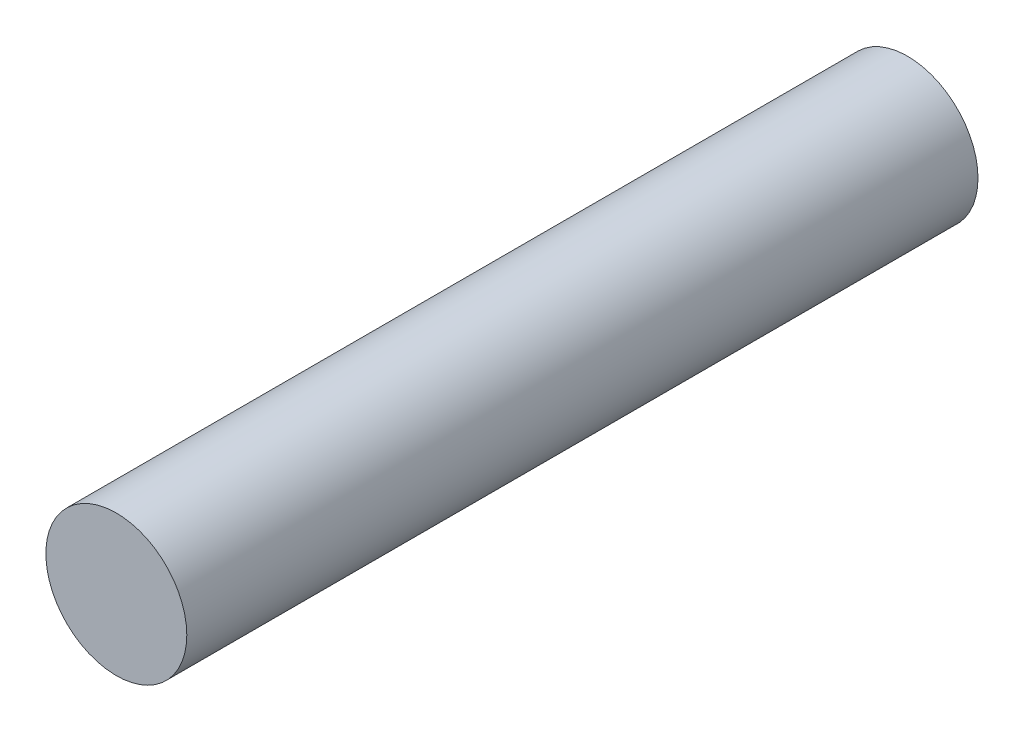
ISO-10303-21;
HEADER;
FILE_DESCRIPTION(('STEP AP214'),'2;1');
FILE_NAME('part.step','',(''),(''),'','','');
FILE_SCHEMA(('AUTOMOTIVE_DESIGN { 1 0 10303 214 1 1 1 1 }'));
ENDSEC;
DATA;
#1=APPLICATION_CONTEXT('core data for automotive mechanical design processes');
#2=APPLICATION_PROTOCOL_DEFINITION('international standard','automotive_design',2000,#1);
#3=PRODUCT_CONTEXT('',#1,'mechanical');
#4=PRODUCT('Part','Part','',(#3));
#5=PRODUCT_RELATED_PRODUCT_CATEGORY('part','',(#4));
#6=PRODUCT_DEFINITION_FORMATION('','',#4);
#7=PRODUCT_DEFINITION_CONTEXT('part definition',#1,'design');
#8=PRODUCT_DEFINITION('design','',#6,#7);
#9=PRODUCT_DEFINITION_SHAPE('','',#8);
#10=(LENGTH_UNIT() NAMED_UNIT(*) SI_UNIT(.MILLI.,.METRE.));
#11=(NAMED_UNIT(*) PLANE_ANGLE_UNIT() SI_UNIT($,.RADIAN.));
#12=(NAMED_UNIT(*) SI_UNIT($,.STERADIAN.) SOLID_ANGLE_UNIT());
#13=UNCERTAINTY_MEASURE_WITH_UNIT(LENGTH_MEASURE(1.E-05),#10,'distance_accuracy_value','');
#14=(GEOMETRIC_REPRESENTATION_CONTEXT(3) GLOBAL_UNCERTAINTY_ASSIGNED_CONTEXT((#13)) GLOBAL_UNIT_ASSIGNED_CONTEXT((#10,
#11,#12)) REPRESENTATION_CONTEXT('',''));
#15=CARTESIAN_POINT('',(0.,0.,0.));
#16=DIRECTION('',(0.,0.,1.));
#17=DIRECTION('',(1.,0.,0.));
#18=AXIS2_PLACEMENT_3D('',#15,#16,#17);
#19=CARTESIAN_POINT('',(0.,0.,19.65));
#20=DIRECTION('',(0.,0.,-1.));
#21=DIRECTION('',(-1.,0.,0.));
#22=AXIS2_PLACEMENT_3D('',#19,#20,#21);
#23=CYLINDRICAL_SURFACE('',#22,1.75);
#24=CARTESIAN_POINT('',(0.,0.,19.65));
#25=DIRECTION('',(0.,0.,1.));
#26=DIRECTION('',(1.,0.,0.));
#27=AXIS2_PLACEMENT_3D('',#24,#25,#26);
#28=CIRCLE('',#27,1.75);
#29=CARTESIAN_POINT('',(1.75,0.,19.65));
#30=VERTEX_POINT('',#29);
#31=EDGE_CURVE('E10',#30,#30,#28,.T.);
#32=ORIENTED_EDGE('',*,*,#31,.F.);
#33=EDGE_LOOP('',(#32));
#34=FACE_BOUND('',#33,.T.);
#35=CARTESIAN_POINT('',(0.,0.,0.));
#36=DIRECTION('',(0.,0.,1.));
#37=DIRECTION('',(1.,0.,0.));
#38=AXIS2_PLACEMENT_3D('',#35,#36,#37);
#39=CIRCLE('',#38,1.75);
#40=CARTESIAN_POINT('',(1.75,0.,0.));
#41=VERTEX_POINT('',#40);
#42=EDGE_CURVE('E44',#41,#41,#39,.T.);
#43=ORIENTED_EDGE('',*,*,#42,.T.);
#44=EDGE_LOOP('',(#43));
#45=FACE_BOUND('',#44,.T.);
#46=ADVANCED_FACE('F41',(#34,#45),#23,.T.);
#47=CARTESIAN_POINT('',(0.,0.,19.65));
#48=DIRECTION('',(0.,0.,1.));
#49=DIRECTION('',(1.,0.,0.));
#50=AXIS2_PLACEMENT_3D('',#47,#48,#49);
#51=PLANE('',#50);
#52=ORIENTED_EDGE('',*,*,#31,.T.);
#53=EDGE_LOOP('',(#52));
#54=FACE_BOUND('',#53,.T.);
#55=ADVANCED_FACE('F58',(#54),#51,.T.);
#56=CARTESIAN_POINT('',(0.,0.,0.));
#57=DIRECTION('',(0.,0.,1.));
#58=DIRECTION('',(1.,0.,0.));
#59=AXIS2_PLACEMENT_3D('',#56,#57,#58);
#60=PLANE('',#59);
#61=ORIENTED_EDGE('',*,*,#42,.F.);
#62=EDGE_LOOP('',(#61));
#63=FACE_BOUND('',#62,.T.);
#64=ADVANCED_FACE('F56',(#63),#60,.F.);
#65=CLOSED_SHELL('',(#46,#55,#64));
#66=MANIFOLD_SOLID_BREP('B2',#65);
#67=ADVANCED_BREP_SHAPE_REPRESENTATION('',(#18,#66),#14);
#68=SHAPE_DEFINITION_REPRESENTATION(#9,#67);
ENDSEC;
END-ISO-10303-21;
